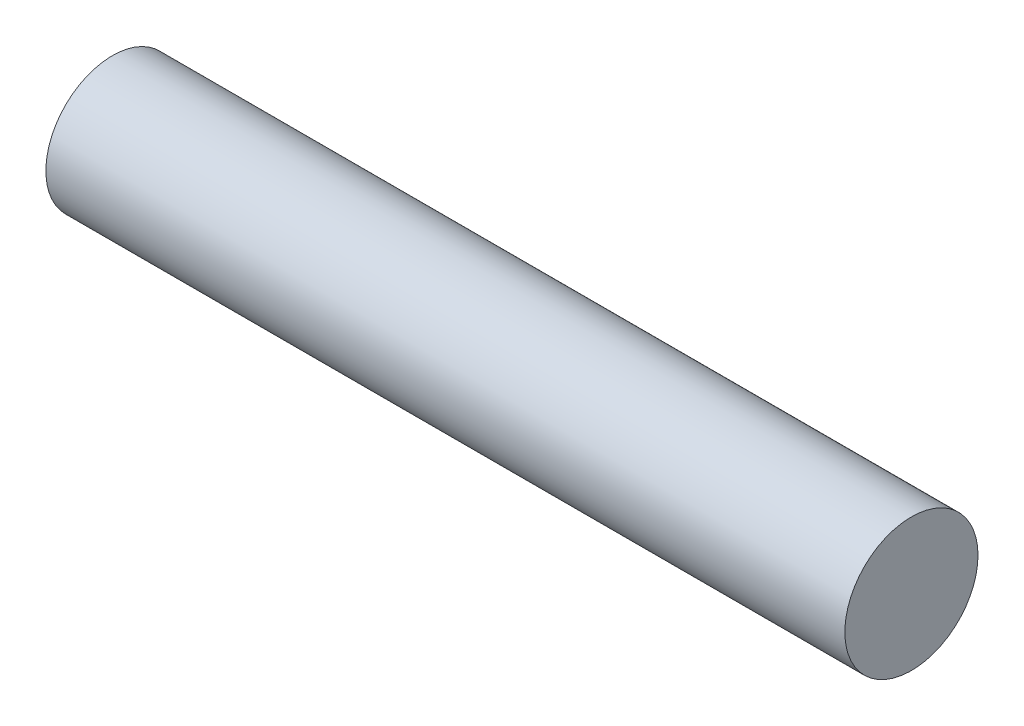
ISO-10303-21;
HEADER;
FILE_DESCRIPTION(('STEP AP214'),'2;1');
FILE_NAME('part.step','',(''),(''),'','','');
FILE_SCHEMA(('AUTOMOTIVE_DESIGN { 1 0 10303 214 1 1 1 1 }'));
ENDSEC;
DATA;
#1=APPLICATION_CONTEXT('core data for automotive mechanical design processes');
#2=APPLICATION_PROTOCOL_DEFINITION('international standard','automotive_design',2000,#1);
#3=PRODUCT_CONTEXT('',#1,'mechanical');
#4=PRODUCT('Part','Part','',(#3));
#5=PRODUCT_RELATED_PRODUCT_CATEGORY('part','',(#4));
#6=PRODUCT_DEFINITION_FORMATION('','',#4);
#7=PRODUCT_DEFINITION_CONTEXT('part definition',#1,'design');
#8=PRODUCT_DEFINITION('design','',#6,#7);
#9=PRODUCT_DEFINITION_SHAPE('','',#8);
#10=(LENGTH_UNIT() NAMED_UNIT(*) SI_UNIT(.MILLI.,.METRE.));
#11=(NAMED_UNIT(*) PLANE_ANGLE_UNIT() SI_UNIT($,.RADIAN.));
#12=(NAMED_UNIT(*) SI_UNIT($,.STERADIAN.) SOLID_ANGLE_UNIT());
#13=UNCERTAINTY_MEASURE_WITH_UNIT(LENGTH_MEASURE(1.E-05),#10,'distance_accuracy_value','');
#14=(GEOMETRIC_REPRESENTATION_CONTEXT(3) GLOBAL_UNCERTAINTY_ASSIGNED_CONTEXT((#13)) GLOBAL_UNIT_ASSIGNED_CONTEXT((#10,
#11,#12)) REPRESENTATION_CONTEXT('',''));
#15=CARTESIAN_POINT('',(0.,0.,0.));
#16=DIRECTION('',(0.,0.,1.));
#17=DIRECTION('',(1.,0.,0.));
#18=AXIS2_PLACEMENT_3D('',#15,#16,#17);
#19=CARTESIAN_POINT('',(12.,0.,0.));
#20=DIRECTION('',(-1.,0.,0.));
#21=DIRECTION('',(0.,0.,1.));
#22=AXIS2_PLACEMENT_3D('',#19,#20,#21);
#23=CYLINDRICAL_SURFACE('',#22,1.);
#24=CARTESIAN_POINT('',(12.,0.,0.));
#25=DIRECTION('',(1.,0.,0.));
#26=DIRECTION('',(0.,0.,-1.));
#27=AXIS2_PLACEMENT_3D('',#24,#25,#26);
#28=CIRCLE('',#27,1.);
#29=CARTESIAN_POINT('',(12.,0.,-1.));
#30=VERTEX_POINT('',#29);
#31=EDGE_CURVE('E10',#30,#30,#28,.T.);
#32=ORIENTED_EDGE('',*,*,#31,.F.);
#33=EDGE_LOOP('',(#32));
#34=FACE_BOUND('',#33,.T.);
#35=CARTESIAN_POINT('',(0.,0.,0.));
#36=DIRECTION('',(1.,0.,0.));
#37=DIRECTION('',(0.,0.,-1.));
#38=AXIS2_PLACEMENT_3D('',#35,#36,#37);
#39=CIRCLE('',#38,1.);
#40=CARTESIAN_POINT('',(0.,0.,-1.));
#41=VERTEX_POINT('',#40);
#42=EDGE_CURVE('E34',#41,#41,#39,.T.);
#43=ORIENTED_EDGE('',*,*,#42,.T.);
#44=EDGE_LOOP('',(#43));
#45=FACE_BOUND('',#44,.T.);
#46=ADVANCED_FACE('F31',(#34,#45),#23,.T.);
#47=CARTESIAN_POINT('',(12.,0.,0.));
#48=DIRECTION('',(1.,0.,0.));
#49=DIRECTION('',(0.,0.,-1.));
#50=AXIS2_PLACEMENT_3D('',#47,#48,#49);
#51=PLANE('',#50);
#52=ORIENTED_EDGE('',*,*,#31,.T.);
#53=EDGE_LOOP('',(#52));
#54=FACE_BOUND('',#53,.T.);
#55=ADVANCED_FACE('F46',(#54),#51,.T.);
#56=CARTESIAN_POINT('',(0.,0.,0.));
#57=DIRECTION('',(1.,0.,0.));
#58=DIRECTION('',(0.,0.,-1.));
#59=AXIS2_PLACEMENT_3D('',#56,#57,#58);
#60=PLANE('',#59);
#61=ORIENTED_EDGE('',*,*,#42,.F.);
#62=EDGE_LOOP('',(#61));
#63=FACE_BOUND('',#62,.T.);
#64=ADVANCED_FACE('F44',(#63),#60,.F.);
#65=CLOSED_SHELL('',(#46,#55,#64));
#66=MANIFOLD_SOLID_BREP('B2',#65);
#67=ADVANCED_BREP_SHAPE_REPRESENTATION('',(#18,#66),#14);
#68=SHAPE_DEFINITION_REPRESENTATION(#9,#67);
ENDSEC;
END-ISO-10303-21;
